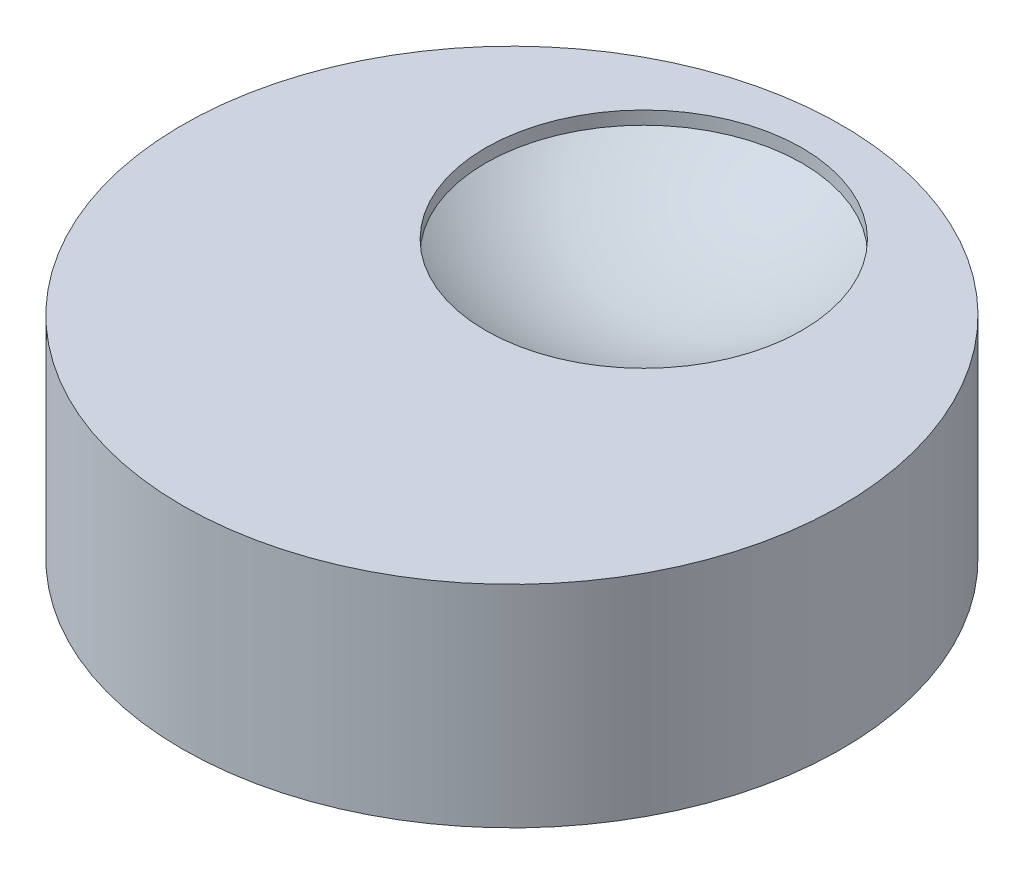
ISO-10303-21;
HEADER;
FILE_DESCRIPTION(('STEP AP214'),'2;1');
FILE_NAME('part.step','',(''),(''),'','','');
FILE_SCHEMA(('AUTOMOTIVE_DESIGN { 1 0 10303 214 1 1 1 1 }'));
ENDSEC;
DATA;
#1=APPLICATION_CONTEXT('core data for automotive mechanical design processes');
#2=APPLICATION_PROTOCOL_DEFINITION('international standard','automotive_design',2000,#1);
#3=PRODUCT_CONTEXT('',#1,'mechanical');
#4=PRODUCT('Part','Part','',(#3));
#5=PRODUCT_RELATED_PRODUCT_CATEGORY('part','',(#4));
#6=PRODUCT_DEFINITION_FORMATION('','',#4);
#7=PRODUCT_DEFINITION_CONTEXT('part definition',#1,'design');
#8=PRODUCT_DEFINITION('design','',#6,#7);
#9=PRODUCT_DEFINITION_SHAPE('','',#8);
#10=(LENGTH_UNIT() NAMED_UNIT(*) SI_UNIT(.MILLI.,.METRE.));
#11=(NAMED_UNIT(*) PLANE_ANGLE_UNIT() SI_UNIT($,.RADIAN.));
#12=(NAMED_UNIT(*) SI_UNIT($,.STERADIAN.) SOLID_ANGLE_UNIT());
#13=UNCERTAINTY_MEASURE_WITH_UNIT(LENGTH_MEASURE(1.E-05),#10,'distance_accuracy_value','');
#14=(GEOMETRIC_REPRESENTATION_CONTEXT(3) GLOBAL_UNCERTAINTY_ASSIGNED_CONTEXT((#13)) GLOBAL_UNIT_ASSIGNED_CONTEXT((#10,
#11,#12)) REPRESENTATION_CONTEXT('',''));
#15=CARTESIAN_POINT('',(0.,0.,0.));
#16=DIRECTION('',(0.,0.,1.));
#17=DIRECTION('',(1.,0.,0.));
#18=AXIS2_PLACEMENT_3D('',#15,#16,#17);
#19=CARTESIAN_POINT('',(0.,8.,0.));
#20=DIRECTION('',(0.,-1.,0.));
#21=DIRECTION('',(0.,0.,-1.));
#22=AXIS2_PLACEMENT_3D('',#19,#20,#21);
#23=CYLINDRICAL_SURFACE('',#22,3.1);
#24=DIRECTION('',(0.,-1.,0.));
#25=VECTOR('',#24,1.);
#26=CARTESIAN_POINT('',(2.85832118559129,8.,1.2));
#27=LINE('',#26,#25);
#28=CARTESIAN_POINT('',(2.85832118559129,5.,1.2));
#29=VERTEX_POINT('',#28);
#30=CARTESIAN_POINT('',(2.85832118559129,0.,1.2));
#31=VERTEX_POINT('',#30);
#32=EDGE_CURVE('E53',#29,#31,#27,.T.);
#33=ORIENTED_EDGE('',*,*,#32,.F.);
#34=CARTESIAN_POINT('',(0.,5.,0.));
#35=DIRECTION('',(0.,1.,0.));
#36=DIRECTION('',(0.,0.,1.));
#37=AXIS2_PLACEMENT_3D('',#34,#35,#36);
#38=CIRCLE('',#37,3.1);
#39=CARTESIAN_POINT('',(-2.85832118559129,5.,1.2));
#40=VERTEX_POINT('',#39);
#41=EDGE_CURVE('E47',#29,#40,#38,.T.);
#42=ORIENTED_EDGE('',*,*,#41,.T.);
#43=DIRECTION('',(0.,-1.,0.));
#44=VECTOR('',#43,1.);
#45=CARTESIAN_POINT('',(-2.85832118559129,8.,1.2));
#46=LINE('',#45,#44);
#47=CARTESIAN_POINT('',(-2.85832118559129,0.,1.2));
#48=VERTEX_POINT('',#47);
#49=EDGE_CURVE('E62',#40,#48,#46,.T.);
#50=ORIENTED_EDGE('',*,*,#49,.T.);
#51=CARTESIAN_POINT('',(0.,0.,0.));
#52=DIRECTION('',(0.,1.,0.));
#53=DIRECTION('',(0.,0.,1.));
#54=AXIS2_PLACEMENT_3D('',#51,#52,#53);
#55=CIRCLE('',#54,3.1);
#56=EDGE_CURVE('E63',#31,#48,#55,.T.);
#57=ORIENTED_EDGE('',*,*,#56,.F.);
#58=EDGE_LOOP('',(#33,#42,#50,#57));
#59=FACE_BOUND('',#58,.T.);
#60=ADVANCED_FACE('F32',(#59),#23,.F.);
#61=CARTESIAN_POINT('',(-2.85832118559129,8.,1.2));
#62=DIRECTION('',(0.,0.,-1.));
#63=DIRECTION('',(-1.,0.,0.));
#64=AXIS2_PLACEMENT_3D('',#61,#62,#63);
#65=PLANE('',#64);
#66=ORIENTED_EDGE('',*,*,#49,.F.);
#67=DIRECTION('',(1.,0.,0.));
#68=VECTOR('',#67,1.);
#69=CARTESIAN_POINT('',(-2.85832118559129,5.,1.2));
#70=LINE('',#69,#68);
#71=EDGE_CURVE('E11',#40,#29,#70,.T.);
#72=ORIENTED_EDGE('',*,*,#71,.T.);
#73=ORIENTED_EDGE('',*,*,#32,.T.);
#74=DIRECTION('',(1.,0.,0.));
#75=VECTOR('',#74,1.);
#76=CARTESIAN_POINT('',(-2.85832118559129,0.,1.2));
#77=LINE('',#76,#75);
#78=EDGE_CURVE('E67',#48,#31,#77,.T.);
#79=ORIENTED_EDGE('',*,*,#78,.F.);
#80=EDGE_LOOP('',(#66,#72,#73,#79));
#81=FACE_BOUND('',#80,.T.);
#82=ADVANCED_FACE('F65',(#81),#65,.T.);
#83=CARTESIAN_POINT('',(0.,8.,0.));
#84=DIRECTION('',(0.,1.,0.));
#85=DIRECTION('',(0.,0.,1.));
#86=AXIS2_PLACEMENT_3D('',#83,#84,#85);
#87=PLANE('',#86);
#88=CARTESIAN_POINT('',(0.,8.,-5.));
#89=DIRECTION('',(0.,1.,0.));
#90=DIRECTION('',(0.,0.,1.));
#91=AXIS2_PLACEMENT_3D('',#88,#89,#90);
#92=CIRCLE('',#91,6.);
#93=CARTESIAN_POINT('',(0.,8.,1.));
#94=VERTEX_POINT('',#93);
#95=EDGE_CURVE('E92',#94,#94,#92,.T.);
#96=ORIENTED_EDGE('',*,*,#95,.F.);
#97=EDGE_LOOP('',(#96));
#98=FACE_BOUND('',#97,.T.);
#99=CARTESIAN_POINT('',(0.,8.,0.));
#100=DIRECTION('',(0.,1.,0.));
#101=DIRECTION('',(0.,0.,1.));
#102=AXIS2_PLACEMENT_3D('',#99,#100,#101);
#103=CIRCLE('',#102,12.5);
#104=CARTESIAN_POINT('',(0.,8.,12.5));
#105=VERTEX_POINT('',#104);
#106=EDGE_CURVE('E41',#105,#105,#103,.T.);
#107=ORIENTED_EDGE('',*,*,#106,.T.);
#108=EDGE_LOOP('',(#107));
#109=FACE_BOUND('',#108,.T.);
#110=ADVANCED_FACE('F79',(#98,#109),#87,.T.);
#111=CARTESIAN_POINT('',(0.,0.,0.));
#112=DIRECTION('',(0.,1.,0.));
#113=DIRECTION('',(0.,0.,1.));
#114=AXIS2_PLACEMENT_3D('',#111,#112,#113);
#115=PLANE('',#114);
#116=CARTESIAN_POINT('',(0.,0.,0.));
#117=DIRECTION('',(0.,1.,0.));
#118=DIRECTION('',(0.,0.,1.));
#119=AXIS2_PLACEMENT_3D('',#116,#117,#118);
#120=CIRCLE('',#119,12.5);
#121=CARTESIAN_POINT('',(0.,0.,12.5));
#122=VERTEX_POINT('',#121);
#123=EDGE_CURVE('E69',#122,#122,#120,.T.);
#124=ORIENTED_EDGE('',*,*,#123,.F.);
#125=EDGE_LOOP('',(#124));
#126=FACE_BOUND('',#125,.T.);
#127=ORIENTED_EDGE('',*,*,#56,.T.);
#128=ORIENTED_EDGE('',*,*,#78,.T.);
#129=EDGE_LOOP('',(#127,#128));
#130=FACE_BOUND('',#129,.T.);
#131=ADVANCED_FACE('F84',(#126,#130),#115,.F.);
#132=CARTESIAN_POINT('',(0.,8.,0.));
#133=DIRECTION('',(0.,-1.,0.));
#134=DIRECTION('',(0.,0.,-1.));
#135=AXIS2_PLACEMENT_3D('',#132,#133,#134);
#136=CYLINDRICAL_SURFACE('',#135,12.5);
#137=ORIENTED_EDGE('',*,*,#106,.F.);
#138=EDGE_LOOP('',(#137));
#139=FACE_BOUND('',#138,.T.);
#140=ORIENTED_EDGE('',*,*,#123,.T.);
#141=EDGE_LOOP('',(#140));
#142=FACE_BOUND('',#141,.T.);
#143=ADVANCED_FACE('F81',(#139,#142),#136,.T.);
#144=CARTESIAN_POINT('',(0.,5.,0.));
#145=DIRECTION('',(0.,1.,0.));
#146=DIRECTION('',(0.,0.,1.));
#147=AXIS2_PLACEMENT_3D('',#144,#145,#146);
#148=PLANE('',#147);
#149=ORIENTED_EDGE('',*,*,#41,.F.);
#150=ORIENTED_EDGE('',*,*,#71,.F.);
#151=EDGE_LOOP('',(#149,#150));
#152=FACE_BOUND('',#151,.T.);
#153=ADVANCED_FACE('F59',(#152),#148,.F.);
#154=CARTESIAN_POINT('',(0.,7.5,-5.));
#155=DIRECTION('',(0.,1.,0.));
#156=DIRECTION('',(0.,0.,1.));
#157=AXIS2_PLACEMENT_3D('',#154,#155,#156);
#158=CYLINDRICAL_SURFACE('',#157,6.);
#159=CARTESIAN_POINT('',(0.,7.5,-5.));
#160=DIRECTION('',(0.,1.,0.));
#161=DIRECTION('',(0.,0.,1.));
#162=AXIS2_PLACEMENT_3D('',#159,#160,#161);
#163=CIRCLE('',#162,6.);
#164=CARTESIAN_POINT('',(0.,7.5,1.));
#165=VERTEX_POINT('',#164);
#166=EDGE_CURVE('E36',#165,#165,#163,.T.);
#167=ORIENTED_EDGE('',*,*,#166,.F.);
#168=EDGE_LOOP('',(#167));
#169=FACE_BOUND('',#168,.T.);
#170=ORIENTED_EDGE('',*,*,#95,.T.);
#171=EDGE_LOOP('',(#170));
#172=FACE_BOUND('',#171,.T.);
#173=ADVANCED_FACE('F100',(#169,#172),#158,.F.);
#174=CARTESIAN_POINT('',(0.,15.5,-5.));
#175=DIRECTION('',(0.,0.,1.));
#176=DIRECTION('',(1.,0.,0.));
#177=AXIS2_PLACEMENT_3D('',#174,#175,#176);
#178=SPHERICAL_SURFACE('',#177,10.);
#179=CARTESIAN_POINT('',(0.,15.5,-5.));
#180=DIRECTION('',(0.,1.,0.));
#181=DIRECTION('',(0.,0.,1.));
#182=AXIS2_PLACEMENT_3D('',#179,#180,#181);
#183=SPHERICAL_SURFACE('',#182,10.);
#184=ORIENTED_EDGE('',*,*,#166,.T.);
#185=EDGE_LOOP('',(#184));
#186=FACE_BOUND('',#185,.T.);
#187=ADVANCED_FACE('F34',(#186),#183,.F.);
#188=CLOSED_SHELL('',(#60,#82,#110,#131,#143,#153,#173,#187));
#189=MANIFOLD_SOLID_BREP('B2',#188);
#190=ADVANCED_BREP_SHAPE_REPRESENTATION('',(#18,#189),#14);
#191=SHAPE_DEFINITION_REPRESENTATION(#9,#190);
ENDSEC;
END-ISO-10303-21;
